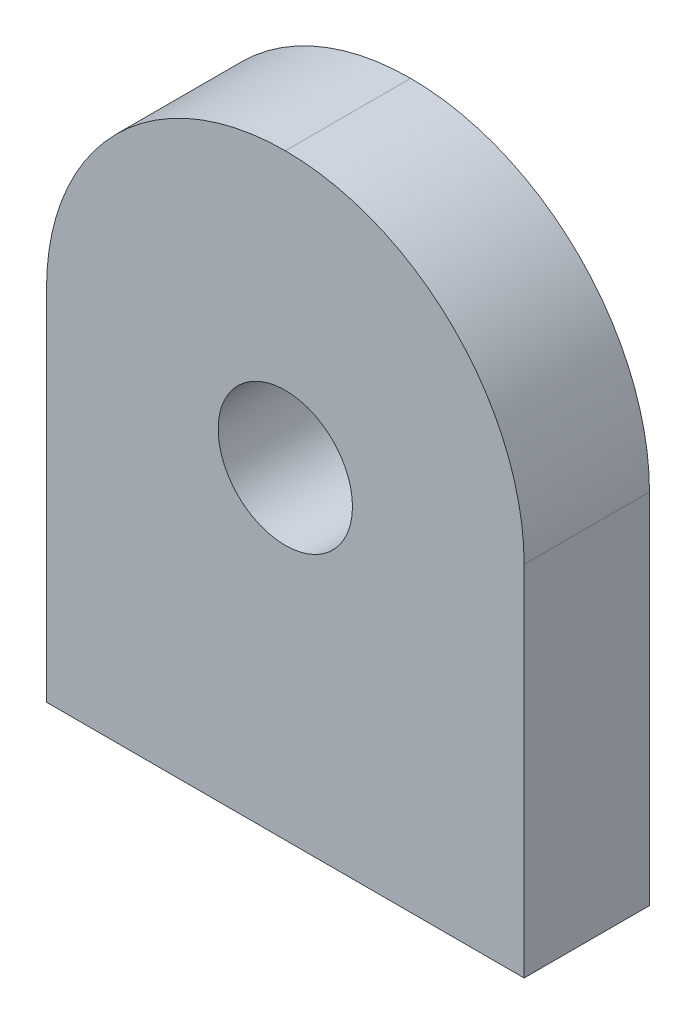
ISO-10303-21;
HEADER;
FILE_DESCRIPTION(('STEP AP214'),'2;1');
FILE_NAME('part.step','',(''),(''),'','','');
FILE_SCHEMA(('AUTOMOTIVE_DESIGN { 1 0 10303 214 1 1 1 1 }'));
ENDSEC;
DATA;
#1=APPLICATION_CONTEXT('core data for automotive mechanical design processes');
#2=APPLICATION_PROTOCOL_DEFINITION('international standard','automotive_design',2000,#1);
#3=PRODUCT_CONTEXT('',#1,'mechanical');
#4=PRODUCT('Part','Part','',(#3));
#5=PRODUCT_RELATED_PRODUCT_CATEGORY('part','',(#4));
#6=PRODUCT_DEFINITION_FORMATION('','',#4);
#7=PRODUCT_DEFINITION_CONTEXT('part definition',#1,'design');
#8=PRODUCT_DEFINITION('design','',#6,#7);
#9=PRODUCT_DEFINITION_SHAPE('','',#8);
#10=(LENGTH_UNIT() NAMED_UNIT(*) SI_UNIT(.MILLI.,.METRE.));
#11=(NAMED_UNIT(*) PLANE_ANGLE_UNIT() SI_UNIT($,.RADIAN.));
#12=(NAMED_UNIT(*) SI_UNIT($,.STERADIAN.) SOLID_ANGLE_UNIT());
#13=UNCERTAINTY_MEASURE_WITH_UNIT(LENGTH_MEASURE(1.E-05),#10,'distance_accuracy_value','');
#14=(GEOMETRIC_REPRESENTATION_CONTEXT(3) GLOBAL_UNCERTAINTY_ASSIGNED_CONTEXT((#13)) GLOBAL_UNIT_ASSIGNED_CONTEXT((#10,
#11,#12)) REPRESENTATION_CONTEXT('',''));
#15=CARTESIAN_POINT('',(0.,0.,0.));
#16=DIRECTION('',(0.,0.,1.));
#17=DIRECTION('',(1.,0.,0.));
#18=AXIS2_PLACEMENT_3D('',#15,#16,#17);
#19=CARTESIAN_POINT('',(0.,0.,4.2));
#20=DIRECTION('',(1.,0.,0.));
#21=DIRECTION('',(0.,0.,-1.));
#22=AXIS2_PLACEMENT_3D('',#19,#20,#21);
#23=PLANE('',#22);
#24=DIRECTION('',(0.,-1.,0.));
#25=VECTOR('',#24,1.);
#26=CARTESIAN_POINT('',(0.,0.,4.2));
#27=LINE('',#26,#25);
#28=CARTESIAN_POINT('',(0.,12.,4.2));
#29=VERTEX_POINT('',#28);
#30=CARTESIAN_POINT('',(0.,0.,4.2));
#31=VERTEX_POINT('',#30);
#32=EDGE_CURVE('E87',#29,#31,#27,.T.);
#33=ORIENTED_EDGE('',*,*,#32,.F.);
#34=DIRECTION('',(0.,0.,-1.));
#35=VECTOR('',#34,1.);
#36=CARTESIAN_POINT('',(0.,12.,4.2));
#37=LINE('',#36,#35);
#38=CARTESIAN_POINT('',(0.,12.,0.));
#39=VERTEX_POINT('',#38);
#40=EDGE_CURVE('E11',#29,#39,#37,.T.);
#41=ORIENTED_EDGE('',*,*,#40,.T.);
#42=DIRECTION('',(0.,-1.,0.));
#43=VECTOR('',#42,1.);
#44=CARTESIAN_POINT('',(0.,0.,0.));
#45=LINE('',#44,#43);
#46=CARTESIAN_POINT('',(0.,0.,0.));
#47=VERTEX_POINT('',#46);
#48=EDGE_CURVE('E109',#39,#47,#45,.T.);
#49=ORIENTED_EDGE('',*,*,#48,.T.);
#50=DIRECTION('',(0.,0.,-1.));
#51=VECTOR('',#50,1.);
#52=CARTESIAN_POINT('',(0.,0.,4.2));
#53=LINE('',#52,#51);
#54=EDGE_CURVE('E101',#31,#47,#53,.T.);
#55=ORIENTED_EDGE('',*,*,#54,.F.);
#56=EDGE_LOOP('',(#33,#41,#49,#55));
#57=FACE_BOUND('',#56,.T.);
#58=ADVANCED_FACE('F45',(#57),#23,.F.);
#59=CARTESIAN_POINT('',(0.,0.,4.2));
#60=DIRECTION('',(0.,1.,0.));
#61=DIRECTION('',(0.,0.,1.));
#62=AXIS2_PLACEMENT_3D('',#59,#60,#61);
#63=PLANE('',#62);
#64=DIRECTION('',(1.,0.,0.));
#65=VECTOR('',#64,1.);
#66=CARTESIAN_POINT('',(0.,0.,0.));
#67=LINE('',#66,#65);
#68=CARTESIAN_POINT('',(16.,0.,0.));
#69=VERTEX_POINT('',#68);
#70=EDGE_CURVE('E142',#47,#69,#67,.T.);
#71=ORIENTED_EDGE('',*,*,#70,.T.);
#72=DIRECTION('',(0.,0.,-1.));
#73=VECTOR('',#72,1.);
#74=CARTESIAN_POINT('',(16.,0.,4.2));
#75=LINE('',#74,#73);
#76=CARTESIAN_POINT('',(16.,0.,4.2));
#77=VERTEX_POINT('',#76);
#78=EDGE_CURVE('E103',#77,#69,#75,.T.);
#79=ORIENTED_EDGE('',*,*,#78,.F.);
#80=DIRECTION('',(1.,0.,0.));
#81=VECTOR('',#80,1.);
#82=CARTESIAN_POINT('',(0.,0.,4.2));
#83=LINE('',#82,#81);
#84=EDGE_CURVE('E90',#31,#77,#83,.T.);
#85=ORIENTED_EDGE('',*,*,#84,.F.);
#86=ORIENTED_EDGE('',*,*,#54,.T.);
#87=EDGE_LOOP('',(#71,#79,#85,#86));
#88=FACE_BOUND('',#87,.T.);
#89=ADVANCED_FACE('F100',(#88),#63,.F.);
#90=CARTESIAN_POINT('',(16.,0.,4.2));
#91=DIRECTION('',(-1.,0.,0.));
#92=DIRECTION('',(0.,0.,1.));
#93=AXIS2_PLACEMENT_3D('',#90,#91,#92);
#94=PLANE('',#93);
#95=DIRECTION('',(0.,1.,0.));
#96=VECTOR('',#95,1.);
#97=CARTESIAN_POINT('',(16.,0.,0.));
#98=LINE('',#97,#96);
#99=CARTESIAN_POINT('',(16.,12.,0.));
#100=VERTEX_POINT('',#99);
#101=EDGE_CURVE('E96',#69,#100,#98,.T.);
#102=ORIENTED_EDGE('',*,*,#101,.T.);
#103=DIRECTION('',(0.,0.,-1.));
#104=VECTOR('',#103,1.);
#105=CARTESIAN_POINT('',(16.,12.,4.2));
#106=LINE('',#105,#104);
#107=CARTESIAN_POINT('',(16.,12.,4.2));
#108=VERTEX_POINT('',#107);
#109=EDGE_CURVE('E123',#100,#108,#106,.F.);
#110=ORIENTED_EDGE('',*,*,#109,.T.);
#111=DIRECTION('',(0.,1.,0.));
#112=VECTOR('',#111,1.);
#113=CARTESIAN_POINT('',(16.,0.,4.2));
#114=LINE('',#113,#112);
#115=EDGE_CURVE('E106',#77,#108,#114,.T.);
#116=ORIENTED_EDGE('',*,*,#115,.F.);
#117=ORIENTED_EDGE('',*,*,#78,.T.);
#118=EDGE_LOOP('',(#102,#110,#116,#117));
#119=FACE_BOUND('',#118,.T.);
#120=ADVANCED_FACE('F133',(#119),#94,.F.);
#121=CARTESIAN_POINT('',(0.,0.,4.2));
#122=DIRECTION('',(0.,0.,-1.));
#123=DIRECTION('',(-1.,0.,0.));
#124=AXIS2_PLACEMENT_3D('',#121,#122,#123);
#125=PLANE('',#124);
#126=CARTESIAN_POINT('',(8.,10.8,4.2));
#127=DIRECTION('',(0.,0.,1.));
#128=DIRECTION('',(1.,0.,0.));
#129=AXIS2_PLACEMENT_3D('',#126,#127,#128);
#130=CIRCLE('',#129,2.25);
#131=CARTESIAN_POINT('',(10.25,10.8,4.2));
#132=VERTEX_POINT('',#131);
#133=EDGE_CURVE('E149',#132,#132,#130,.T.);
#134=ORIENTED_EDGE('',*,*,#133,.F.);
#135=EDGE_LOOP('',(#134));
#136=FACE_BOUND('',#135,.T.);
#137=ORIENTED_EDGE('',*,*,#115,.T.);
#138=CARTESIAN_POINT('',(8.,12.,4.2));
#139=DIRECTION('',(0.,0.,-1.));
#140=DIRECTION('',(-1.,0.,0.));
#141=AXIS2_PLACEMENT_3D('',#138,#139,#140);
#142=CIRCLE('',#141,8.);
#143=CARTESIAN_POINT('',(8.,20.,4.2));
#144=VERTEX_POINT('',#143);
#145=EDGE_CURVE('E55',#108,#144,#142,.F.);
#146=ORIENTED_EDGE('',*,*,#145,.T.);
#147=CARTESIAN_POINT('',(8.,12.,4.2));
#148=DIRECTION('',(0.,0.,-1.));
#149=DIRECTION('',(-1.,0.,0.));
#150=AXIS2_PLACEMENT_3D('',#147,#148,#149);
#151=CIRCLE('',#150,8.);
#152=EDGE_CURVE('E65',#144,#29,#151,.F.);
#153=ORIENTED_EDGE('',*,*,#152,.T.);
#154=ORIENTED_EDGE('',*,*,#32,.T.);
#155=ORIENTED_EDGE('',*,*,#84,.T.);
#156=EDGE_LOOP('',(#137,#146,#153,#154,#155));
#157=FACE_BOUND('',#156,.T.);
#158=ADVANCED_FACE('F89',(#136,#157),#125,.F.);
#159=CARTESIAN_POINT('',(0.,0.,0.));
#160=DIRECTION('',(0.,0.,-1.));
#161=DIRECTION('',(-1.,0.,0.));
#162=AXIS2_PLACEMENT_3D('',#159,#160,#161);
#163=PLANE('',#162);
#164=CARTESIAN_POINT('',(8.,10.8,0.));
#165=DIRECTION('',(0.,0.,1.));
#166=DIRECTION('',(1.,0.,0.));
#167=AXIS2_PLACEMENT_3D('',#164,#165,#166);
#168=CIRCLE('',#167,2.25);
#169=CARTESIAN_POINT('',(10.25,10.8,0.));
#170=VERTEX_POINT('',#169);
#171=EDGE_CURVE('E143',#170,#170,#168,.T.);
#172=ORIENTED_EDGE('',*,*,#171,.T.);
#173=EDGE_LOOP('',(#172));
#174=FACE_BOUND('',#173,.T.);
#175=CARTESIAN_POINT('',(8.,12.,0.));
#176=DIRECTION('',(0.,0.,-1.));
#177=DIRECTION('',(-1.,0.,0.));
#178=AXIS2_PLACEMENT_3D('',#175,#176,#177);
#179=CIRCLE('',#178,8.);
#180=CARTESIAN_POINT('',(8.,20.,0.));
#181=VERTEX_POINT('',#180);
#182=EDGE_CURVE('E112',#39,#181,#179,.T.);
#183=ORIENTED_EDGE('',*,*,#182,.T.);
#184=CARTESIAN_POINT('',(8.,12.,0.));
#185=DIRECTION('',(0.,0.,-1.));
#186=DIRECTION('',(-1.,0.,0.));
#187=AXIS2_PLACEMENT_3D('',#184,#185,#186);
#188=CIRCLE('',#187,8.);
#189=EDGE_CURVE('E116',#181,#100,#188,.T.);
#190=ORIENTED_EDGE('',*,*,#189,.T.);
#191=ORIENTED_EDGE('',*,*,#101,.F.);
#192=ORIENTED_EDGE('',*,*,#70,.F.);
#193=ORIENTED_EDGE('',*,*,#48,.F.);
#194=EDGE_LOOP('',(#183,#190,#191,#192,#193));
#195=FACE_BOUND('',#194,.T.);
#196=ADVANCED_FACE('F160',(#174,#195),#163,.T.);
#197=CARTESIAN_POINT('',(8.,10.8,0.));
#198=DIRECTION('',(0.,0.,1.));
#199=DIRECTION('',(1.,0.,0.));
#200=AXIS2_PLACEMENT_3D('',#197,#198,#199);
#201=CYLINDRICAL_SURFACE('',#200,2.25);
#202=ORIENTED_EDGE('',*,*,#171,.F.);
#203=EDGE_LOOP('',(#202));
#204=FACE_BOUND('',#203,.T.);
#205=ORIENTED_EDGE('',*,*,#133,.T.);
#206=EDGE_LOOP('',(#205));
#207=FACE_BOUND('',#206,.T.);
#208=ADVANCED_FACE('F162',(#204,#207),#201,.F.);
#209=CARTESIAN_POINT('',(8.,12.,4.2));
#210=DIRECTION('',(0.,0.,-1.));
#211=DIRECTION('',(-1.,0.,0.));
#212=AXIS2_PLACEMENT_3D('',#209,#210,#211);
#213=CYLINDRICAL_SURFACE('',#212,8.);
#214=ORIENTED_EDGE('',*,*,#40,.F.);
#215=ORIENTED_EDGE('',*,*,#152,.F.);
#216=DIRECTION('',(0.,0.,-1.));
#217=VECTOR('',#216,1.);
#218=CARTESIAN_POINT('',(8.,20.,4.2));
#219=LINE('',#218,#217);
#220=EDGE_CURVE('E49',#181,#144,#219,.F.);
#221=ORIENTED_EDGE('',*,*,#220,.F.);
#222=ORIENTED_EDGE('',*,*,#182,.F.);
#223=EDGE_LOOP('',(#214,#215,#221,#222));
#224=FACE_BOUND('',#223,.T.);
#225=ADVANCED_FACE('F47',(#224),#213,.T.);
#226=CARTESIAN_POINT('',(8.,12.,4.2));
#227=DIRECTION('',(0.,0.,-1.));
#228=DIRECTION('',(-1.,0.,0.));
#229=AXIS2_PLACEMENT_3D('',#226,#227,#228);
#230=CYLINDRICAL_SURFACE('',#229,8.);
#231=ORIENTED_EDGE('',*,*,#145,.F.);
#232=ORIENTED_EDGE('',*,*,#109,.F.);
#233=ORIENTED_EDGE('',*,*,#189,.F.);
#234=ORIENTED_EDGE('',*,*,#220,.T.);
#235=EDGE_LOOP('',(#231,#232,#233,#234));
#236=FACE_BOUND('',#235,.T.);
#237=ADVANCED_FACE('F156',(#236),#230,.T.);
#238=CLOSED_SHELL('',(#58,#89,#120,#158,#196,#208,#225,#237));
#239=MANIFOLD_SOLID_BREP('B2',#238);
#240=ADVANCED_BREP_SHAPE_REPRESENTATION('',(#18,#239),#14);
#241=SHAPE_DEFINITION_REPRESENTATION(#9,#240);
ENDSEC;
END-ISO-10303-21;
